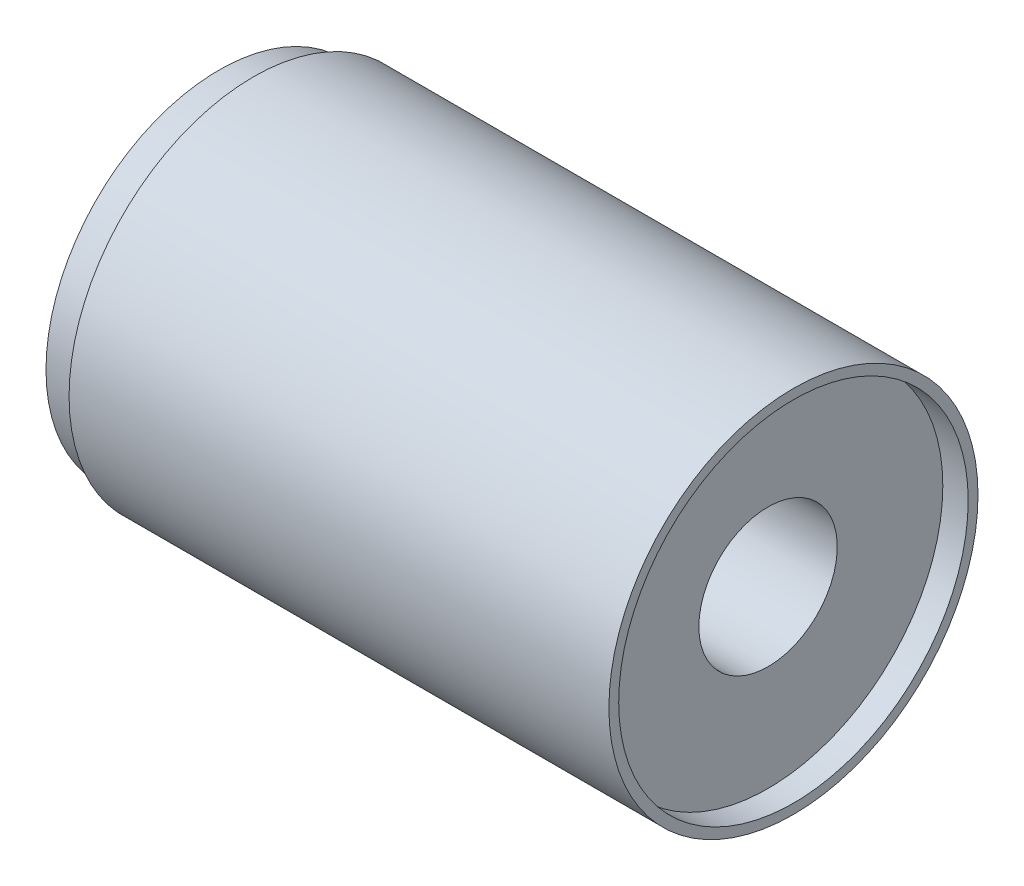
ISO-10303-21;
HEADER;
FILE_DESCRIPTION(('STEP AP214'),'2;1');
FILE_NAME('part.step','',(''),(''),'','','');
FILE_SCHEMA(('AUTOMOTIVE_DESIGN { 1 0 10303 214 1 1 1 1 }'));
ENDSEC;
DATA;
#1=APPLICATION_CONTEXT('core data for automotive mechanical design processes');
#2=APPLICATION_PROTOCOL_DEFINITION('international standard','automotive_design',2000,#1);
#3=PRODUCT_CONTEXT('',#1,'mechanical');
#4=PRODUCT('Part','Part','',(#3));
#5=PRODUCT_RELATED_PRODUCT_CATEGORY('part','',(#4));
#6=PRODUCT_DEFINITION_FORMATION('','',#4);
#7=PRODUCT_DEFINITION_CONTEXT('part definition',#1,'design');
#8=PRODUCT_DEFINITION('design','',#6,#7);
#9=PRODUCT_DEFINITION_SHAPE('','',#8);
#10=(LENGTH_UNIT() NAMED_UNIT(*) SI_UNIT(.MILLI.,.METRE.));
#11=(NAMED_UNIT(*) PLANE_ANGLE_UNIT() SI_UNIT($,.RADIAN.));
#12=(NAMED_UNIT(*) SI_UNIT($,.STERADIAN.) SOLID_ANGLE_UNIT());
#13=UNCERTAINTY_MEASURE_WITH_UNIT(LENGTH_MEASURE(1.E-05),#10,'distance_accuracy_value','');
#14=(GEOMETRIC_REPRESENTATION_CONTEXT(3) GLOBAL_UNCERTAINTY_ASSIGNED_CONTEXT((#13)) GLOBAL_UNIT_ASSIGNED_CONTEXT((#10,
#11,#12)) REPRESENTATION_CONTEXT('',''));
#15=CARTESIAN_POINT('',(0.,0.,0.));
#16=DIRECTION('',(0.,0.,1.));
#17=DIRECTION('',(1.,0.,0.));
#18=AXIS2_PLACEMENT_3D('',#15,#16,#17);
#19=CARTESIAN_POINT('',(19.9,0.,3.25));
#20=DIRECTION('',(-1.,0.,0.));
#21=DIRECTION('',(0.,0.,1.));
#22=AXIS2_PLACEMENT_3D('',#19,#20,#21);
#23=PLANE('',#22);
#24=CARTESIAN_POINT('',(19.9,0.,0.));
#25=DIRECTION('',(1.,0.,0.));
#26=DIRECTION('',(0.,0.,-1.));
#27=AXIS2_PLACEMENT_3D('',#24,#25,#26);
#28=CIRCLE('',#27,3.5);
#29=CARTESIAN_POINT('',(19.9,0.,-3.5));
#30=VERTEX_POINT('',#29);
#31=EDGE_CURVE('E16',#30,#30,#28,.T.);
#32=ORIENTED_EDGE('',*,*,#31,.F.);
#33=EDGE_LOOP('',(#32));
#34=FACE_BOUND('',#33,.T.);
#35=CARTESIAN_POINT('',(19.9,0.,0.));
#36=DIRECTION('',(-1.,0.,0.));
#37=DIRECTION('',(0.,0.,1.));
#38=AXIS2_PLACEMENT_3D('',#35,#36,#37);
#39=CIRCLE('',#38,3.);
#40=CARTESIAN_POINT('',(19.9,0.,3.));
#41=VERTEX_POINT('',#40);
#42=EDGE_CURVE('E44',#41,#41,#39,.F.);
#43=ORIENTED_EDGE('',*,*,#42,.T.);
#44=EDGE_LOOP('',(#43));
#45=FACE_BOUND('',#44,.T.);
#46=ADVANCED_FACE('F13',(#34,#45),#23,.T.);
#47=CARTESIAN_POINT('',(20.3,0.,0.));
#48=DIRECTION('',(1.,0.,0.));
#49=DIRECTION('',(0.,0.,-1.));
#50=AXIS2_PLACEMENT_3D('',#47,#48,#49);
#51=CYLINDRICAL_SURFACE('',#50,3.5);
#52=CARTESIAN_POINT('',(20.7,0.,0.));
#53=DIRECTION('',(1.,0.,0.));
#54=DIRECTION('',(0.,0.,-1.));
#55=AXIS2_PLACEMENT_3D('',#52,#53,#54);
#56=CIRCLE('',#55,3.5);
#57=CARTESIAN_POINT('',(20.7,0.,-3.5));
#58=VERTEX_POINT('',#57);
#59=EDGE_CURVE('E42',#58,#58,#56,.T.);
#60=ORIENTED_EDGE('',*,*,#59,.F.);
#61=EDGE_LOOP('',(#60));
#62=FACE_BOUND('',#61,.T.);
#63=ORIENTED_EDGE('',*,*,#31,.T.);
#64=EDGE_LOOP('',(#63));
#65=FACE_BOUND('',#64,.T.);
#66=ADVANCED_FACE('F51',(#62,#65),#51,.T.);
#67=CARTESIAN_POINT('',(33.15,0.,0.));
#68=DIRECTION('',(-1.,0.,0.));
#69=DIRECTION('',(0.,0.,1.));
#70=AXIS2_PLACEMENT_3D('',#67,#68,#69);
#71=CYLINDRICAL_SURFACE('',#70,3.);
#72=ORIENTED_EDGE('',*,*,#42,.F.);
#73=EDGE_LOOP('',(#72));
#74=FACE_BOUND('',#73,.T.);
#75=CARTESIAN_POINT('',(44.5,0.,0.));
#76=DIRECTION('',(-1.,0.,0.));
#77=DIRECTION('',(0.,0.,1.));
#78=AXIS2_PLACEMENT_3D('',#75,#76,#77);
#79=CIRCLE('',#78,3.);
#80=CARTESIAN_POINT('',(44.5,0.,3.));
#81=VERTEX_POINT('',#80);
#82=EDGE_CURVE('E39',#81,#81,#79,.F.);
#83=ORIENTED_EDGE('',*,*,#82,.T.);
#84=EDGE_LOOP('',(#83));
#85=FACE_BOUND('',#84,.T.);
#86=ADVANCED_FACE('F60',(#74,#85),#71,.F.);
#87=CARTESIAN_POINT('',(20.7,0.,5.25));
#88=DIRECTION('',(-1.,0.,0.));
#89=DIRECTION('',(0.,0.,1.));
#90=AXIS2_PLACEMENT_3D('',#87,#88,#89);
#91=PLANE('',#90);
#92=CARTESIAN_POINT('',(20.7,0.,0.));
#93=DIRECTION('',(-1.,0.,0.));
#94=DIRECTION('',(0.,0.,1.));
#95=AXIS2_PLACEMENT_3D('',#92,#93,#94);
#96=CIRCLE('',#95,7.5);
#97=CARTESIAN_POINT('',(20.7,0.,7.5));
#98=VERTEX_POINT('',#97);
#99=EDGE_CURVE('E36',#98,#98,#96,.F.);
#100=ORIENTED_EDGE('',*,*,#99,.F.);
#101=EDGE_LOOP('',(#100));
#102=FACE_BOUND('',#101,.T.);
#103=ORIENTED_EDGE('',*,*,#59,.T.);
#104=EDGE_LOOP('',(#103));
#105=FACE_BOUND('',#104,.T.);
#106=ADVANCED_FACE('F89',(#102,#105),#91,.T.);
#107=CARTESIAN_POINT('',(44.5,0.,0.));
#108=DIRECTION('',(-1.,0.,0.));
#109=DIRECTION('',(0.,0.,1.));
#110=AXIS2_PLACEMENT_3D('',#107,#108,#109);
#111=PLANE('',#110);
#112=CARTESIAN_POINT('',(44.5,0.,0.));
#113=DIRECTION('',(1.,0.,0.));
#114=DIRECTION('',(0.,0.,-1.));
#115=AXIS2_PLACEMENT_3D('',#112,#113,#114);
#116=CIRCLE('',#115,7.575);
#117=CARTESIAN_POINT('',(44.5,0.,-7.575));
#118=VERTEX_POINT('',#117);
#119=EDGE_CURVE('E33',#118,#118,#116,.T.);
#120=ORIENTED_EDGE('',*,*,#119,.T.);
#121=EDGE_LOOP('',(#120));
#122=FACE_BOUND('',#121,.T.);
#123=ORIENTED_EDGE('',*,*,#82,.F.);
#124=EDGE_LOOP('',(#123));
#125=FACE_BOUND('',#124,.T.);
#126=ADVANCED_FACE('F85',(#122,#125),#111,.F.);
#127=CARTESIAN_POINT('',(21.45,0.,0.));
#128=DIRECTION('',(-1.,0.,0.));
#129=DIRECTION('',(0.,0.,1.));
#130=AXIS2_PLACEMENT_3D('',#127,#128,#129);
#131=CYLINDRICAL_SURFACE('',#130,7.5);
#132=CARTESIAN_POINT('',(22.2,0.,0.));
#133=DIRECTION('',(-1.,0.,0.));
#134=DIRECTION('',(0.,0.,1.));
#135=AXIS2_PLACEMENT_3D('',#132,#133,#134);
#136=CIRCLE('',#135,7.5);
#137=CARTESIAN_POINT('',(22.2,0.,7.5));
#138=VERTEX_POINT('',#137);
#139=EDGE_CURVE('E30',#138,#138,#136,.F.);
#140=ORIENTED_EDGE('',*,*,#139,.F.);
#141=EDGE_LOOP('',(#140));
#142=FACE_BOUND('',#141,.T.);
#143=ORIENTED_EDGE('',*,*,#99,.T.);
#144=EDGE_LOOP('',(#143));
#145=FACE_BOUND('',#144,.T.);
#146=ADVANCED_FACE('F81',(#142,#145),#131,.T.);
#147=CARTESIAN_POINT('',(45.05,0.,0.));
#148=DIRECTION('',(1.,0.,0.));
#149=DIRECTION('',(0.,0.,-1.));
#150=AXIS2_PLACEMENT_3D('',#147,#148,#149);
#151=CYLINDRICAL_SURFACE('',#150,7.575);
#152=CARTESIAN_POINT('',(45.6,0.,0.));
#153=DIRECTION('',(1.,0.,0.));
#154=DIRECTION('',(0.,0.,-1.));
#155=AXIS2_PLACEMENT_3D('',#152,#153,#154);
#156=CIRCLE('',#155,7.575);
#157=CARTESIAN_POINT('',(45.6,0.,-7.575));
#158=VERTEX_POINT('',#157);
#159=EDGE_CURVE('E25',#158,#158,#156,.F.);
#160=ORIENTED_EDGE('',*,*,#159,.F.);
#161=EDGE_LOOP('',(#160));
#162=FACE_BOUND('',#161,.T.);
#163=ORIENTED_EDGE('',*,*,#119,.F.);
#164=EDGE_LOOP('',(#163));
#165=FACE_BOUND('',#164,.T.);
#166=ADVANCED_FACE('F77',(#162,#165),#151,.F.);
#167=CARTESIAN_POINT('',(22.2,0.,7.75));
#168=DIRECTION('',(-1.,0.,0.));
#169=DIRECTION('',(0.,0.,1.));
#170=AXIS2_PLACEMENT_3D('',#167,#168,#169);
#171=PLANE('',#170);
#172=ORIENTED_EDGE('',*,*,#139,.T.);
#173=EDGE_LOOP('',(#172));
#174=FACE_BOUND('',#173,.T.);
#175=CARTESIAN_POINT('',(22.2,0.,0.));
#176=DIRECTION('',(-1.,0.,0.));
#177=DIRECTION('',(0.,0.,1.));
#178=AXIS2_PLACEMENT_3D('',#175,#176,#177);
#179=CIRCLE('',#178,8.);
#180=CARTESIAN_POINT('',(22.2,0.,8.));
#181=VERTEX_POINT('',#180);
#182=EDGE_CURVE('E20',#181,#181,#179,.F.);
#183=ORIENTED_EDGE('',*,*,#182,.F.);
#184=EDGE_LOOP('',(#183));
#185=FACE_BOUND('',#184,.T.);
#186=ADVANCED_FACE('F71',(#174,#185),#171,.T.);
#187=CARTESIAN_POINT('',(45.6,0.,5.5));
#188=DIRECTION('',(1.,0.,0.));
#189=DIRECTION('',(0.,0.,-1.));
#190=AXIS2_PLACEMENT_3D('',#187,#188,#189);
#191=PLANE('',#190);
#192=CARTESIAN_POINT('',(45.6,0.,0.));
#193=DIRECTION('',(-1.,0.,0.));
#194=DIRECTION('',(0.,0.,1.));
#195=AXIS2_PLACEMENT_3D('',#192,#193,#194);
#196=CIRCLE('',#195,8.);
#197=CARTESIAN_POINT('',(45.6,0.,8.));
#198=VERTEX_POINT('',#197);
#199=EDGE_CURVE('E9',#198,#198,#196,.T.);
#200=ORIENTED_EDGE('',*,*,#199,.F.);
#201=EDGE_LOOP('',(#200));
#202=FACE_BOUND('',#201,.T.);
#203=ORIENTED_EDGE('',*,*,#159,.T.);
#204=EDGE_LOOP('',(#203));
#205=FACE_BOUND('',#204,.T.);
#206=ADVANCED_FACE('F64',(#202,#205),#191,.T.);
#207=CARTESIAN_POINT('',(33.9,0.,0.));
#208=DIRECTION('',(-1.,0.,0.));
#209=DIRECTION('',(0.,0.,1.));
#210=AXIS2_PLACEMENT_3D('',#207,#208,#209);
#211=CYLINDRICAL_SURFACE('',#210,8.);
#212=ORIENTED_EDGE('',*,*,#182,.T.);
#213=EDGE_LOOP('',(#212));
#214=FACE_BOUND('',#213,.T.);
#215=ORIENTED_EDGE('',*,*,#199,.T.);
#216=EDGE_LOOP('',(#215));
#217=FACE_BOUND('',#216,.T.);
#218=ADVANCED_FACE('F62',(#214,#217),#211,.T.);
#219=CLOSED_SHELL('',(#46,#66,#86,#106,#126,#146,#166,#186,#206,#218));
#220=MANIFOLD_SOLID_BREP('B1',#219);
#221=ADVANCED_BREP_SHAPE_REPRESENTATION('',(#18,#220),#14);
#222=SHAPE_DEFINITION_REPRESENTATION(#9,#221);
ENDSEC;
END-ISO-10303-21;
